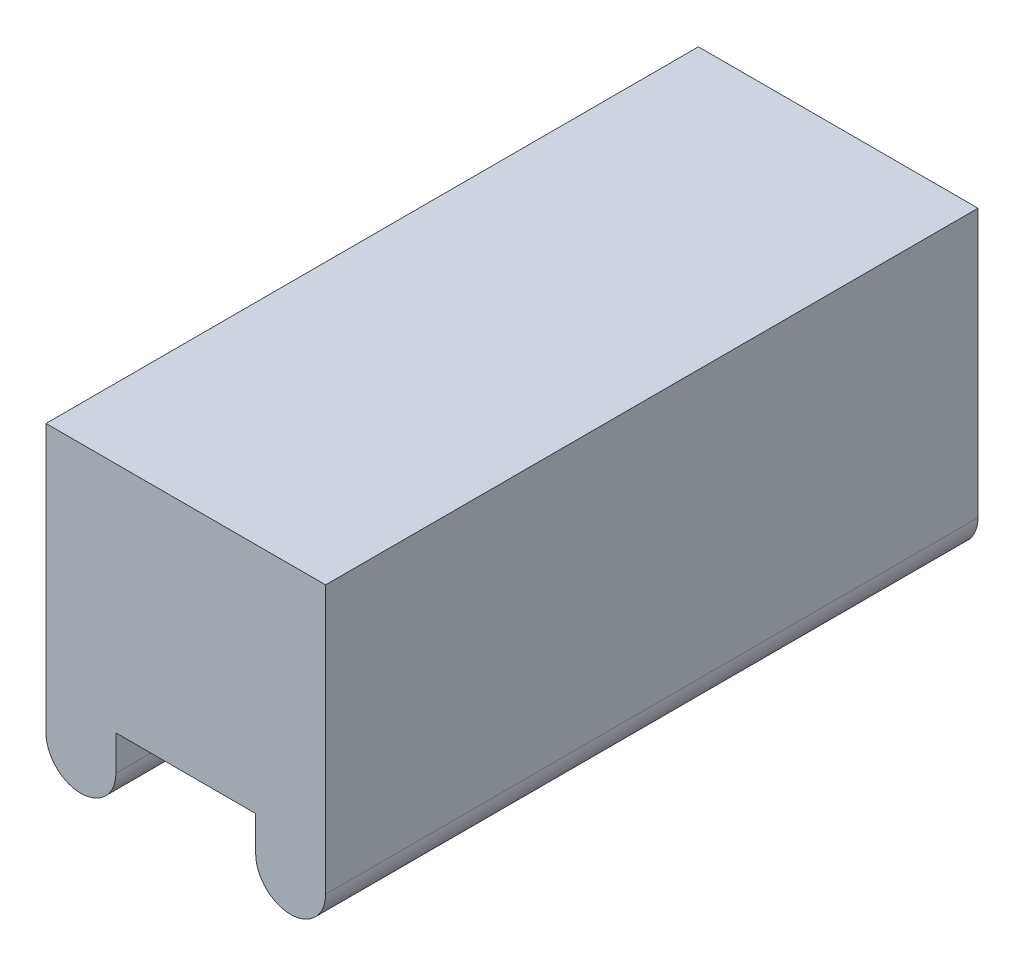
ISO-10303-21;
HEADER;
FILE_DESCRIPTION(('STEP AP214'),'2;1');
FILE_NAME('part.step','',(''),(''),'','','');
FILE_SCHEMA(('AUTOMOTIVE_DESIGN { 1 0 10303 214 1 1 1 1 }'));
ENDSEC;
DATA;
#1=APPLICATION_CONTEXT('core data for automotive mechanical design processes');
#2=APPLICATION_PROTOCOL_DEFINITION('international standard','automotive_design',2000,#1);
#3=PRODUCT_CONTEXT('',#1,'mechanical');
#4=PRODUCT('Part','Part','',(#3));
#5=PRODUCT_RELATED_PRODUCT_CATEGORY('part','',(#4));
#6=PRODUCT_DEFINITION_FORMATION('','',#4);
#7=PRODUCT_DEFINITION_CONTEXT('part definition',#1,'design');
#8=PRODUCT_DEFINITION('design','',#6,#7);
#9=PRODUCT_DEFINITION_SHAPE('','',#8);
#10=(LENGTH_UNIT() NAMED_UNIT(*) SI_UNIT(.MILLI.,.METRE.));
#11=(NAMED_UNIT(*) PLANE_ANGLE_UNIT() SI_UNIT($,.RADIAN.));
#12=(NAMED_UNIT(*) SI_UNIT($,.STERADIAN.) SOLID_ANGLE_UNIT());
#13=UNCERTAINTY_MEASURE_WITH_UNIT(LENGTH_MEASURE(1.E-05),#10,'distance_accuracy_value','');
#14=(GEOMETRIC_REPRESENTATION_CONTEXT(3) GLOBAL_UNCERTAINTY_ASSIGNED_CONTEXT((#13)) GLOBAL_UNIT_ASSIGNED_CONTEXT((#10,
#11,#12)) REPRESENTATION_CONTEXT('',''));
#15=CARTESIAN_POINT('',(0.,0.,0.));
#16=DIRECTION('',(0.,0.,1.));
#17=DIRECTION('',(1.,0.,0.));
#18=AXIS2_PLACEMENT_3D('',#15,#16,#17);
#19=CARTESIAN_POINT('',(-4.5,-6.5,28.));
#20=DIRECTION('',(0.,0.,-1.));
#21=DIRECTION('',(-1.,0.,0.));
#22=AXIS2_PLACEMENT_3D('',#19,#20,#21);
#23=CYLINDRICAL_SURFACE('',#22,1.5);
#24=CARTESIAN_POINT('',(-4.5,-6.5,0.));
#25=DIRECTION('',(0.,0.,1.));
#26=DIRECTION('',(1.,0.,0.));
#27=AXIS2_PLACEMENT_3D('',#24,#25,#26);
#28=CIRCLE('',#27,1.5);
#29=CARTESIAN_POINT('',(-6.,-6.5,0.));
#30=VERTEX_POINT('',#29);
#31=CARTESIAN_POINT('',(-3.,-6.5,0.));
#32=VERTEX_POINT('',#31);
#33=EDGE_CURVE('E144',#30,#32,#28,.T.);
#34=ORIENTED_EDGE('',*,*,#33,.T.);
#35=DIRECTION('',(0.,0.,-1.));
#36=VECTOR('',#35,1.);
#37=CARTESIAN_POINT('',(-3.,-6.5,28.));
#38=LINE('',#37,#36);
#39=CARTESIAN_POINT('',(-3.,-6.5,28.));
#40=VERTEX_POINT('',#39);
#41=EDGE_CURVE('E52',#40,#32,#38,.T.);
#42=ORIENTED_EDGE('',*,*,#41,.F.);
#43=CARTESIAN_POINT('',(-4.5,-6.5,28.));
#44=DIRECTION('',(0.,0.,1.));
#45=DIRECTION('',(1.,0.,0.));
#46=AXIS2_PLACEMENT_3D('',#43,#44,#45);
#47=CIRCLE('',#46,1.5);
#48=CARTESIAN_POINT('',(-6.,-6.5,28.));
#49=VERTEX_POINT('',#48);
#50=EDGE_CURVE('E103',#49,#40,#47,.T.);
#51=ORIENTED_EDGE('',*,*,#50,.F.);
#52=DIRECTION('',(0.,0.,-1.));
#53=VECTOR('',#52,1.);
#54=CARTESIAN_POINT('',(-6.,-6.5,28.));
#55=LINE('',#54,#53);
#56=EDGE_CURVE('E13',#49,#30,#55,.T.);
#57=ORIENTED_EDGE('',*,*,#56,.T.);
#58=EDGE_LOOP('',(#34,#42,#51,#57));
#59=FACE_BOUND('',#58,.T.);
#60=ADVANCED_FACE('F44',(#59),#23,.T.);
#61=CARTESIAN_POINT('',(-3.,-6.5,28.));
#62=DIRECTION('',(-1.,0.,0.));
#63=DIRECTION('',(0.,0.,1.));
#64=AXIS2_PLACEMENT_3D('',#61,#62,#63);
#65=PLANE('',#64);
#66=DIRECTION('',(0.,1.,0.));
#67=VECTOR('',#66,1.);
#68=CARTESIAN_POINT('',(-3.,-6.5,0.));
#69=LINE('',#68,#67);
#70=CARTESIAN_POINT('',(-3.,-5.,0.));
#71=VERTEX_POINT('',#70);
#72=EDGE_CURVE('E146',#32,#71,#69,.T.);
#73=ORIENTED_EDGE('',*,*,#72,.T.);
#74=DIRECTION('',(0.,0.,-1.));
#75=VECTOR('',#74,1.);
#76=CARTESIAN_POINT('',(-3.,-5.,28.));
#77=LINE('',#76,#75);
#78=CARTESIAN_POINT('',(-3.,-5.,28.));
#79=VERTEX_POINT('',#78);
#80=EDGE_CURVE('E163',#79,#71,#77,.T.);
#81=ORIENTED_EDGE('',*,*,#80,.F.);
#82=DIRECTION('',(0.,1.,0.));
#83=VECTOR('',#82,1.);
#84=CARTESIAN_POINT('',(-3.,-6.5,28.));
#85=LINE('',#84,#83);
#86=EDGE_CURVE('E171',#40,#79,#85,.T.);
#87=ORIENTED_EDGE('',*,*,#86,.F.);
#88=ORIENTED_EDGE('',*,*,#41,.T.);
#89=EDGE_LOOP('',(#73,#81,#87,#88));
#90=FACE_BOUND('',#89,.T.);
#91=ADVANCED_FACE('F169',(#90),#65,.F.);
#92=CARTESIAN_POINT('',(-3.,-5.,28.));
#93=DIRECTION('',(0.,1.,0.));
#94=DIRECTION('',(-1.,0.,0.));
#95=AXIS2_PLACEMENT_3D('',#92,#93,#94);
#96=PLANE('',#95);
#97=DIRECTION('',(1.,0.,0.));
#98=VECTOR('',#97,1.);
#99=CARTESIAN_POINT('',(-3.,-5.,0.));
#100=LINE('',#99,#98);
#101=CARTESIAN_POINT('',(3.,-5.,0.));
#102=VERTEX_POINT('',#101);
#103=EDGE_CURVE('E148',#71,#102,#100,.T.);
#104=ORIENTED_EDGE('',*,*,#103,.T.);
#105=DIRECTION('',(0.,0.,-1.));
#106=VECTOR('',#105,1.);
#107=CARTESIAN_POINT('',(3.,-5.,28.));
#108=LINE('',#107,#106);
#109=CARTESIAN_POINT('',(3.,-5.,28.));
#110=VERTEX_POINT('',#109);
#111=EDGE_CURVE('E160',#110,#102,#108,.T.);
#112=ORIENTED_EDGE('',*,*,#111,.F.);
#113=DIRECTION('',(1.,0.,0.));
#114=VECTOR('',#113,1.);
#115=CARTESIAN_POINT('',(-3.,-5.,28.));
#116=LINE('',#115,#114);
#117=EDGE_CURVE('E184',#79,#110,#116,.T.);
#118=ORIENTED_EDGE('',*,*,#117,.F.);
#119=ORIENTED_EDGE('',*,*,#80,.T.);
#120=EDGE_LOOP('',(#104,#112,#118,#119));
#121=FACE_BOUND('',#120,.T.);
#122=ADVANCED_FACE('F180',(#121),#96,.F.);
#123=CARTESIAN_POINT('',(3.,-6.5,28.));
#124=DIRECTION('',(1.,0.,0.));
#125=DIRECTION('',(0.,1.,0.));
#126=AXIS2_PLACEMENT_3D('',#123,#124,#125);
#127=PLANE('',#126);
#128=DIRECTION('',(0.,-1.,0.));
#129=VECTOR('',#128,1.);
#130=CARTESIAN_POINT('',(3.,-6.5,0.));
#131=LINE('',#130,#129);
#132=CARTESIAN_POINT('',(3.,-6.5,0.));
#133=VERTEX_POINT('',#132);
#134=EDGE_CURVE('E150',#102,#133,#131,.T.);
#135=ORIENTED_EDGE('',*,*,#134,.T.);
#136=DIRECTION('',(0.,0.,-1.));
#137=VECTOR('',#136,1.);
#138=CARTESIAN_POINT('',(3.,-6.5,28.));
#139=LINE('',#138,#137);
#140=CARTESIAN_POINT('',(3.,-6.5,28.));
#141=VERTEX_POINT('',#140);
#142=EDGE_CURVE('E133',#141,#133,#139,.T.);
#143=ORIENTED_EDGE('',*,*,#142,.F.);
#144=DIRECTION('',(0.,-1.,0.));
#145=VECTOR('',#144,1.);
#146=CARTESIAN_POINT('',(3.,-6.5,28.));
#147=LINE('',#146,#145);
#148=EDGE_CURVE('E123',#110,#141,#147,.T.);
#149=ORIENTED_EDGE('',*,*,#148,.F.);
#150=ORIENTED_EDGE('',*,*,#111,.T.);
#151=EDGE_LOOP('',(#135,#143,#149,#150));
#152=FACE_BOUND('',#151,.T.);
#153=ADVANCED_FACE('F183',(#152),#127,.F.);
#154=CARTESIAN_POINT('',(4.5,-6.5,28.));
#155=DIRECTION('',(0.,0.,-1.));
#156=DIRECTION('',(-1.,0.,0.));
#157=AXIS2_PLACEMENT_3D('',#154,#155,#156);
#158=CYLINDRICAL_SURFACE('',#157,1.5);
#159=CARTESIAN_POINT('',(4.5,-6.5,0.));
#160=DIRECTION('',(0.,0.,1.));
#161=DIRECTION('',(-1.,0.,0.));
#162=AXIS2_PLACEMENT_3D('',#159,#160,#161);
#163=CIRCLE('',#162,1.5);
#164=CARTESIAN_POINT('',(6.,-6.5,0.));
#165=VERTEX_POINT('',#164);
#166=EDGE_CURVE('E132',#133,#165,#163,.T.);
#167=ORIENTED_EDGE('',*,*,#166,.T.);
#168=DIRECTION('',(0.,0.,-1.));
#169=VECTOR('',#168,1.);
#170=CARTESIAN_POINT('',(6.,-6.5,28.));
#171=LINE('',#170,#169);
#172=CARTESIAN_POINT('',(6.,-6.5,28.));
#173=VERTEX_POINT('',#172);
#174=EDGE_CURVE('E129',#173,#165,#171,.T.);
#175=ORIENTED_EDGE('',*,*,#174,.F.);
#176=CARTESIAN_POINT('',(4.5,-6.5,28.));
#177=DIRECTION('',(0.,0.,1.));
#178=DIRECTION('',(-1.,0.,0.));
#179=AXIS2_PLACEMENT_3D('',#176,#177,#178);
#180=CIRCLE('',#179,1.5);
#181=EDGE_CURVE('E117',#141,#173,#180,.T.);
#182=ORIENTED_EDGE('',*,*,#181,.F.);
#183=ORIENTED_EDGE('',*,*,#142,.T.);
#184=EDGE_LOOP('',(#167,#175,#182,#183));
#185=FACE_BOUND('',#184,.T.);
#186=ADVANCED_FACE('F130',(#185),#158,.T.);
#187=CARTESIAN_POINT('',(6.,-5.,28.));
#188=DIRECTION('',(-1.,0.,0.));
#189=DIRECTION('',(0.,0.,1.));
#190=AXIS2_PLACEMENT_3D('',#187,#188,#189);
#191=PLANE('',#190);
#192=DIRECTION('',(0.,1.,0.));
#193=VECTOR('',#192,1.);
#194=CARTESIAN_POINT('',(6.,-5.,0.));
#195=LINE('',#194,#193);
#196=CARTESIAN_POINT('',(6.,5.,0.));
#197=VERTEX_POINT('',#196);
#198=EDGE_CURVE('E89',#165,#197,#195,.T.);
#199=ORIENTED_EDGE('',*,*,#198,.T.);
#200=DIRECTION('',(0.,0.,-1.));
#201=VECTOR('',#200,1.);
#202=CARTESIAN_POINT('',(6.,5.,28.));
#203=LINE('',#202,#201);
#204=CARTESIAN_POINT('',(6.,5.,28.));
#205=VERTEX_POINT('',#204);
#206=EDGE_CURVE('E134',#205,#197,#203,.T.);
#207=ORIENTED_EDGE('',*,*,#206,.F.);
#208=DIRECTION('',(0.,1.,0.));
#209=VECTOR('',#208,1.);
#210=CARTESIAN_POINT('',(6.,-6.5,28.));
#211=LINE('',#210,#209);
#212=EDGE_CURVE('E121',#173,#205,#211,.T.);
#213=ORIENTED_EDGE('',*,*,#212,.F.);
#214=ORIENTED_EDGE('',*,*,#174,.T.);
#215=EDGE_LOOP('',(#199,#207,#213,#214));
#216=FACE_BOUND('',#215,.T.);
#217=ADVANCED_FACE('F136',(#216),#191,.F.);
#218=CARTESIAN_POINT('',(-6.,5.,28.));
#219=DIRECTION('',(0.,-1.,0.));
#220=DIRECTION('',(0.,0.,-1.));
#221=AXIS2_PLACEMENT_3D('',#218,#219,#220);
#222=PLANE('',#221);
#223=DIRECTION('',(-1.,0.,0.));
#224=VECTOR('',#223,1.);
#225=CARTESIAN_POINT('',(-6.,5.,0.));
#226=LINE('',#225,#224);
#227=CARTESIAN_POINT('',(-6.,5.,0.));
#228=VERTEX_POINT('',#227);
#229=EDGE_CURVE('E96',#197,#228,#226,.T.);
#230=ORIENTED_EDGE('',*,*,#229,.T.);
#231=DIRECTION('',(0.,0.,-1.));
#232=VECTOR('',#231,1.);
#233=CARTESIAN_POINT('',(-6.,5.,28.));
#234=LINE('',#233,#232);
#235=CARTESIAN_POINT('',(-6.,5.,28.));
#236=VERTEX_POINT('',#235);
#237=EDGE_CURVE('E140',#236,#228,#234,.T.);
#238=ORIENTED_EDGE('',*,*,#237,.F.);
#239=DIRECTION('',(-1.,0.,0.));
#240=VECTOR('',#239,1.);
#241=CARTESIAN_POINT('',(-6.,5.,28.));
#242=LINE('',#241,#240);
#243=EDGE_CURVE('E138',#205,#236,#242,.T.);
#244=ORIENTED_EDGE('',*,*,#243,.F.);
#245=ORIENTED_EDGE('',*,*,#206,.T.);
#246=EDGE_LOOP('',(#230,#238,#244,#245));
#247=FACE_BOUND('',#246,.T.);
#248=ADVANCED_FACE('F205',(#247),#222,.F.);
#249=CARTESIAN_POINT('',(-6.,-5.,28.));
#250=DIRECTION('',(1.,0.,0.));
#251=DIRECTION('',(0.,1.,0.));
#252=AXIS2_PLACEMENT_3D('',#249,#250,#251);
#253=PLANE('',#252);
#254=DIRECTION('',(0.,-1.,0.));
#255=VECTOR('',#254,1.);
#256=CARTESIAN_POINT('',(-6.,-5.,0.));
#257=LINE('',#256,#255);
#258=EDGE_CURVE('E155',#228,#30,#257,.T.);
#259=ORIENTED_EDGE('',*,*,#258,.T.);
#260=ORIENTED_EDGE('',*,*,#56,.F.);
#261=DIRECTION('',(0.,-1.,0.));
#262=VECTOR('',#261,1.);
#263=CARTESIAN_POINT('',(-6.,-6.5,28.));
#264=LINE('',#263,#262);
#265=EDGE_CURVE('E60',#236,#49,#264,.T.);
#266=ORIENTED_EDGE('',*,*,#265,.F.);
#267=ORIENTED_EDGE('',*,*,#237,.T.);
#268=EDGE_LOOP('',(#259,#260,#266,#267));
#269=FACE_BOUND('',#268,.T.);
#270=ADVANCED_FACE('F189',(#269),#253,.F.);
#271=CARTESIAN_POINT('',(4.5,-6.5,28.));
#272=DIRECTION('',(0.,0.,-1.));
#273=DIRECTION('',(-1.,0.,0.));
#274=AXIS2_PLACEMENT_3D('',#271,#272,#273);
#275=PLANE('',#274);
#276=ORIENTED_EDGE('',*,*,#265,.T.);
#277=ORIENTED_EDGE('',*,*,#50,.T.);
#278=ORIENTED_EDGE('',*,*,#86,.T.);
#279=ORIENTED_EDGE('',*,*,#117,.T.);
#280=ORIENTED_EDGE('',*,*,#148,.T.);
#281=ORIENTED_EDGE('',*,*,#181,.T.);
#282=ORIENTED_EDGE('',*,*,#212,.T.);
#283=ORIENTED_EDGE('',*,*,#243,.T.);
#284=EDGE_LOOP('',(#276,#277,#278,#279,#280,#281,#282,#283));
#285=FACE_BOUND('',#284,.T.);
#286=ADVANCED_FACE('F119',(#285),#275,.F.);
#287=CARTESIAN_POINT('',(4.5,-6.5,0.));
#288=DIRECTION('',(0.,0.,-1.));
#289=DIRECTION('',(-1.,0.,0.));
#290=AXIS2_PLACEMENT_3D('',#287,#288,#289);
#291=PLANE('',#290);
#292=ORIENTED_EDGE('',*,*,#33,.F.);
#293=ORIENTED_EDGE('',*,*,#258,.F.);
#294=ORIENTED_EDGE('',*,*,#229,.F.);
#295=ORIENTED_EDGE('',*,*,#198,.F.);
#296=ORIENTED_EDGE('',*,*,#166,.F.);
#297=ORIENTED_EDGE('',*,*,#134,.F.);
#298=ORIENTED_EDGE('',*,*,#103,.F.);
#299=ORIENTED_EDGE('',*,*,#72,.F.);
#300=EDGE_LOOP('',(#292,#293,#294,#295,#296,#297,#298,#299));
#301=FACE_BOUND('',#300,.T.);
#302=ADVANCED_FACE('F175',(#301),#291,.T.);
#303=CLOSED_SHELL('',(#60,#91,#122,#153,#186,#217,#248,#270,#286,#302));
#304=MANIFOLD_SOLID_BREP('B2',#303);
#305=ADVANCED_BREP_SHAPE_REPRESENTATION('',(#18,#304),#14);
#306=SHAPE_DEFINITION_REPRESENTATION(#9,#305);
ENDSEC;
END-ISO-10303-21;
